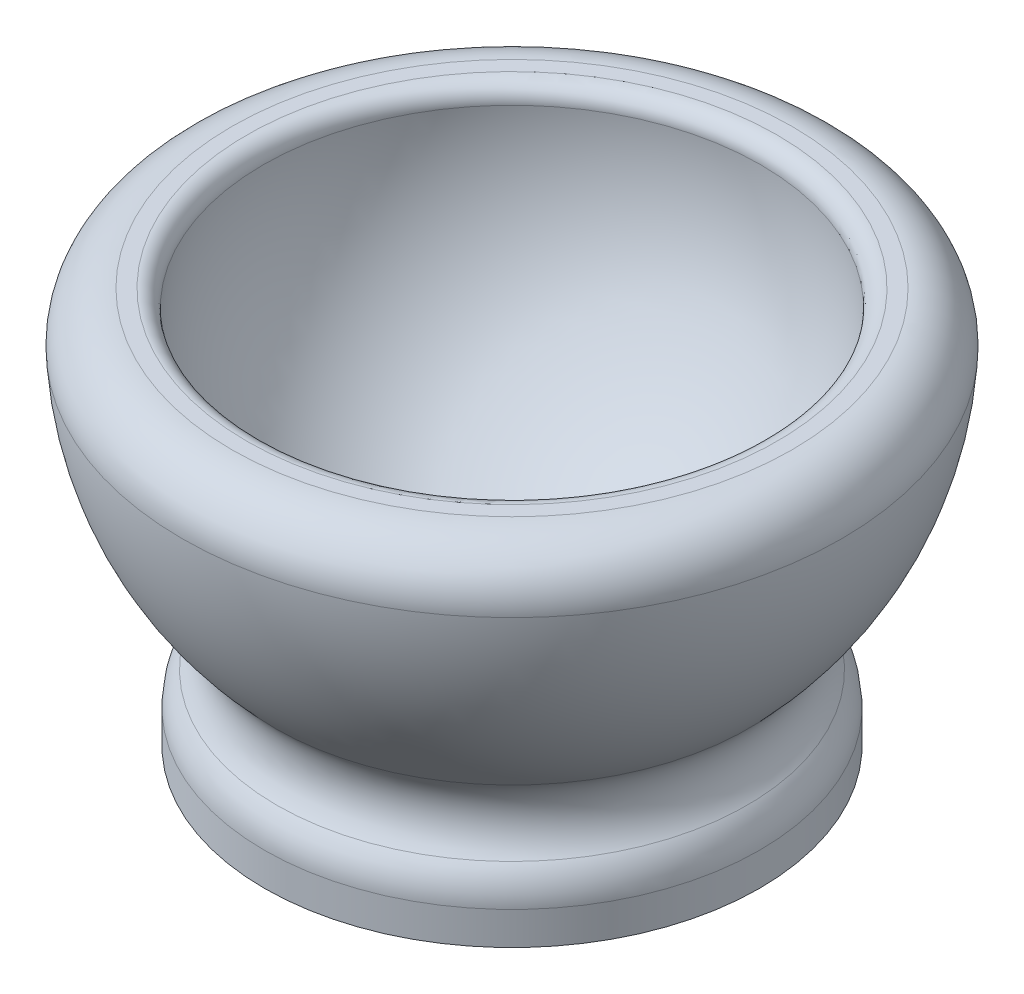
ISO-10303-21;
HEADER;
FILE_DESCRIPTION(('STEP AP214'),'2;1');
FILE_NAME('part.step','',(''),(''),'','','');
FILE_SCHEMA(('AUTOMOTIVE_DESIGN { 1 0 10303 214 1 1 1 1 }'));
ENDSEC;
DATA;
#1=APPLICATION_CONTEXT('core data for automotive mechanical design processes');
#2=APPLICATION_PROTOCOL_DEFINITION('international standard','automotive_design',2000,#1);
#3=PRODUCT_CONTEXT('',#1,'mechanical');
#4=PRODUCT('Part','Part','',(#3));
#5=PRODUCT_RELATED_PRODUCT_CATEGORY('part','',(#4));
#6=PRODUCT_DEFINITION_FORMATION('','',#4);
#7=PRODUCT_DEFINITION_CONTEXT('part definition',#1,'design');
#8=PRODUCT_DEFINITION('design','',#6,#7);
#9=PRODUCT_DEFINITION_SHAPE('','',#8);
#10=(LENGTH_UNIT() NAMED_UNIT(*) SI_UNIT(.MILLI.,.METRE.));
#11=(NAMED_UNIT(*) PLANE_ANGLE_UNIT() SI_UNIT($,.RADIAN.));
#12=(NAMED_UNIT(*) SI_UNIT($,.STERADIAN.) SOLID_ANGLE_UNIT());
#13=UNCERTAINTY_MEASURE_WITH_UNIT(LENGTH_MEASURE(1.E-05),#10,'distance_accuracy_value','');
#14=(GEOMETRIC_REPRESENTATION_CONTEXT(3) GLOBAL_UNCERTAINTY_ASSIGNED_CONTEXT((#13)) GLOBAL_UNIT_ASSIGNED_CONTEXT((#10,
#11,#12)) REPRESENTATION_CONTEXT('',''));
#15=CARTESIAN_POINT('',(0.,0.,0.));
#16=DIRECTION('',(0.,0.,1.));
#17=DIRECTION('',(1.,0.,0.));
#18=AXIS2_PLACEMENT_3D('',#15,#16,#17);
#19=CARTESIAN_POINT('',(0.,0.,0.));
#20=DIRECTION('',(-1.,0.,0.));
#21=DIRECTION('',(0.,0.,-1.));
#22=AXIS2_PLACEMENT_3D('',#19,#20,#21);
#23=SPHERICAL_SURFACE('',#22,20.);
#24=CARTESIAN_POINT('',(0.,0.,0.));
#25=DIRECTION('',(0.,1.,0.));
#26=DIRECTION('',(0.,0.,1.));
#27=AXIS2_PLACEMENT_3D('',#24,#25,#26);
#28=SPHERICAL_SURFACE('',#27,20.);
#29=CARTESIAN_POINT('',(0.,-13.9367014642688,0.));
#30=DIRECTION('',(0.,1.,0.));
#31=DIRECTION('',(0.,0.,1.));
#32=AXIS2_PLACEMENT_3D('',#29,#30,#31);
#33=CIRCLE('',#32,14.3446279943346);
#34=CARTESIAN_POINT('',(0.,-13.9367014642688,14.3446279943346));
#35=VERTEX_POINT('',#34);
#36=EDGE_CURVE('E39',#35,#35,#33,.T.);
#37=ORIENTED_EDGE('',*,*,#36,.T.);
#38=EDGE_LOOP('',(#37));
#39=FACE_BOUND('',#38,.T.);
#40=CARTESIAN_POINT('',(0.,-1.17647058823529,0.));
#41=DIRECTION('',(0.,1.,0.));
#42=DIRECTION('',(0.,0.,1.));
#43=AXIS2_PLACEMENT_3D('',#40,#41,#42);
#44=CIRCLE('',#43,19.9653679393849);
#45=CARTESIAN_POINT('',(0.,-1.17647058823529,19.9653679393849));
#46=VERTEX_POINT('',#45);
#47=EDGE_CURVE('E47',#46,#46,#44,.F.);
#48=ORIENTED_EDGE('',*,*,#47,.T.);
#49=EDGE_LOOP('',(#48));
#50=FACE_BOUND('',#49,.T.);
#51=ADVANCED_FACE('F32',(#39,#50),#28,.T.);
#52=CARTESIAN_POINT('',(0.,0.,0.));
#53=DIRECTION('',(-1.,0.,0.));
#54=DIRECTION('',(0.,0.,-1.));
#55=AXIS2_PLACEMENT_3D('',#52,#53,#54);
#56=SPHERICAL_SURFACE('',#55,15.1);
#57=CARTESIAN_POINT('',(0.,0.,0.));
#58=DIRECTION('',(0.,-1.,0.));
#59=DIRECTION('',(0.,0.,-1.));
#60=AXIS2_PLACEMENT_3D('',#57,#58,#59);
#61=SPHERICAL_SURFACE('',#60,15.1);
#62=CARTESIAN_POINT('',(0.,0.937888198757764,0.));
#63=DIRECTION('',(0.,-1.,0.));
#64=DIRECTION('',(0.,0.,-1.));
#65=AXIS2_PLACEMENT_3D('',#62,#63,#64);
#66=CIRCLE('',#65,15.0708448909353);
#67=CARTESIAN_POINT('',(0.,0.937888198757764,-15.0708448909353));
#68=VERTEX_POINT('',#67);
#69=EDGE_CURVE('E55',#68,#68,#66,.F.);
#70=ORIENTED_EDGE('',*,*,#69,.T.);
#71=EDGE_LOOP('',(#70));
#72=FACE_BOUND('',#71,.T.);
#73=ADVANCED_FACE('F82',(#72),#61,.F.);
#74=CARTESIAN_POINT('',(-20.,2.,37.180631687919));
#75=DIRECTION('',(0.,-1.,0.));
#76=DIRECTION('',(0.,0.,-1.));
#77=AXIS2_PLACEMENT_3D('',#74,#75,#76);
#78=PLANE('',#77);
#79=CARTESIAN_POINT('',(0.,2.,0.));
#80=DIRECTION('',(0.,-1.,0.));
#81=DIRECTION('',(0.,0.,-1.));
#82=AXIS2_PLACEMENT_3D('',#79,#80,#81);
#83=CIRCLE('',#82,16.9705627484771);
#84=CARTESIAN_POINT('',(0.,2.,-16.9705627484771));
#85=VERTEX_POINT('',#84);
#86=EDGE_CURVE('E52',#85,#85,#83,.F.);
#87=ORIENTED_EDGE('',*,*,#86,.T.);
#88=EDGE_LOOP('',(#87));
#89=FACE_BOUND('',#88,.T.);
#90=CARTESIAN_POINT('',(0.,2.,0.));
#91=DIRECTION('',(0.,-1.,0.));
#92=DIRECTION('',(0.,0.,-1.));
#93=AXIS2_PLACEMENT_3D('',#90,#91,#92);
#94=CIRCLE('',#93,16.0689140890105);
#95=CARTESIAN_POINT('',(0.,2.,-16.0689140890105));
#96=VERTEX_POINT('',#95);
#97=EDGE_CURVE('E58',#96,#96,#94,.T.);
#98=ORIENTED_EDGE('',*,*,#97,.T.);
#99=EDGE_LOOP('',(#98));
#100=FACE_BOUND('',#99,.T.);
#101=ADVANCED_FACE('F78',(#89,#100),#78,.F.);
#102=CARTESIAN_POINT('',(0.,1.,0.));
#103=DIRECTION('',(0.,-1.,0.));
#104=DIRECTION('',(0.,0.,-1.));
#105=AXIS2_PLACEMENT_3D('',#102,#103,#104);
#106=TOROIDAL_SURFACE('',#105,16.0689140890105,1.);
#107=ORIENTED_EDGE('',*,*,#69,.F.);
#108=EDGE_LOOP('',(#107));
#109=FACE_BOUND('',#108,.T.);
#110=ORIENTED_EDGE('',*,*,#97,.F.);
#111=EDGE_LOOP('',(#110));
#112=FACE_BOUND('',#111,.T.);
#113=ADVANCED_FACE('F69',(#109,#112),#106,.T.);
#114=CARTESIAN_POINT('',(0.,-17.,0.));
#115=DIRECTION('',(0.,-1.,0.));
#116=DIRECTION('',(0.,0.,-1.));
#117=AXIS2_PLACEMENT_3D('',#114,#115,#116);
#118=CYLINDRICAL_SURFACE('',#117,15.);
#119=CARTESIAN_POINT('',(0.,-20.,0.));
#120=DIRECTION('',(0.,-1.,0.));
#121=DIRECTION('',(0.,0.,-1.));
#122=AXIS2_PLACEMENT_3D('',#119,#120,#121);
#123=CIRCLE('',#122,15.);
#124=CARTESIAN_POINT('',(0.,-20.,-15.));
#125=VERTEX_POINT('',#124);
#126=EDGE_CURVE('E43',#125,#125,#123,.T.);
#127=ORIENTED_EDGE('',*,*,#126,.T.);
#128=EDGE_LOOP('',(#127));
#129=FACE_BOUND('',#128,.T.);
#130=CARTESIAN_POINT('',(0.,-22.,0.));
#131=DIRECTION('',(0.,-1.,0.));
#132=DIRECTION('',(0.,0.,-1.));
#133=AXIS2_PLACEMENT_3D('',#130,#131,#132);
#134=CIRCLE('',#133,15.);
#135=CARTESIAN_POINT('',(0.,-22.,-15.));
#136=VERTEX_POINT('',#135);
#137=EDGE_CURVE('E61',#136,#136,#134,.T.);
#138=ORIENTED_EDGE('',*,*,#137,.F.);
#139=EDGE_LOOP('',(#138));
#140=FACE_BOUND('',#139,.T.);
#141=ADVANCED_FACE('F67',(#129,#140),#118,.T.);
#142=CARTESIAN_POINT('',(0.,-22.,0.));
#143=DIRECTION('',(0.,1.,0.));
#144=DIRECTION('',(0.,0.,1.));
#145=AXIS2_PLACEMENT_3D('',#142,#143,#144);
#146=PLANE('',#145);
#147=ORIENTED_EDGE('',*,*,#137,.T.);
#148=EDGE_LOOP('',(#147));
#149=FACE_BOUND('',#148,.T.);
#150=ADVANCED_FACE('F65',(#149),#146,.F.);
#151=CARTESIAN_POINT('',(0.,-1.,0.));
#152=DIRECTION('',(0.,-1.,0.));
#153=DIRECTION('',(0.,0.,-1.));
#154=AXIS2_PLACEMENT_3D('',#151,#152,#153);
#155=TOROIDAL_SURFACE('',#154,16.9705627484771,3.);
#156=ORIENTED_EDGE('',*,*,#47,.F.);
#157=EDGE_LOOP('',(#156));
#158=FACE_BOUND('',#157,.T.);
#159=ORIENTED_EDGE('',*,*,#86,.F.);
#160=EDGE_LOOP('',(#159));
#161=FACE_BOUND('',#160,.T.);
#162=ADVANCED_FACE('F76',(#158,#161),#155,.T.);
#163=CARTESIAN_POINT('',(0.,-20.,0.));
#164=DIRECTION('',(0.,-1.,0.));
#165=DIRECTION('',(0.,0.,-1.));
#166=AXIS2_PLACEMENT_3D('',#163,#164,#165);
#167=TOROIDAL_SURFACE('',#166,12.,3.);
#168=CARTESIAN_POINT('',(0.,-18.0136033419546,0.));
#169=DIRECTION('',(0.,-1.,0.));
#170=DIRECTION('',(0.,0.,-1.));
#171=AXIS2_PLACEMENT_3D('',#168,#169,#170);
#172=CIRCLE('',#171,14.2481610967424);
#173=CARTESIAN_POINT('',(0.,-18.0136033419546,-14.2481610967424));
#174=VERTEX_POINT('',#173);
#175=EDGE_CURVE('E10',#174,#174,#172,.T.);
#176=ORIENTED_EDGE('',*,*,#175,.T.);
#177=EDGE_LOOP('',(#176));
#178=FACE_BOUND('',#177,.T.);
#179=ORIENTED_EDGE('',*,*,#126,.F.);
#180=EDGE_LOOP('',(#179));
#181=FACE_BOUND('',#180,.T.);
#182=ADVANCED_FACE('F93',(#178,#181),#167,.T.);
#183=CARTESIAN_POINT('',(0.,-16.0272066839091,0.));
#184=DIRECTION('',(0.,1.,0.));
#185=DIRECTION('',(0.,0.,1.));
#186=AXIS2_PLACEMENT_3D('',#183,#184,#185);
#187=TOROIDAL_SURFACE('',#186,16.4963221934848,3.);
#188=ORIENTED_EDGE('',*,*,#175,.F.);
#189=EDGE_LOOP('',(#188));
#190=FACE_BOUND('',#189,.T.);
#191=ORIENTED_EDGE('',*,*,#36,.F.);
#192=EDGE_LOOP('',(#191));
#193=FACE_BOUND('',#192,.T.);
#194=ADVANCED_FACE('F34',(#190,#193),#187,.F.);
#195=CLOSED_SHELL('',(#51,#73,#101,#113,#141,#150,#162,#182,#194));
#196=MANIFOLD_SOLID_BREP('B2',#195);
#197=ADVANCED_BREP_SHAPE_REPRESENTATION('',(#18,#196),#14);
#198=SHAPE_DEFINITION_REPRESENTATION(#9,#197);
ENDSEC;
END-ISO-10303-21;
